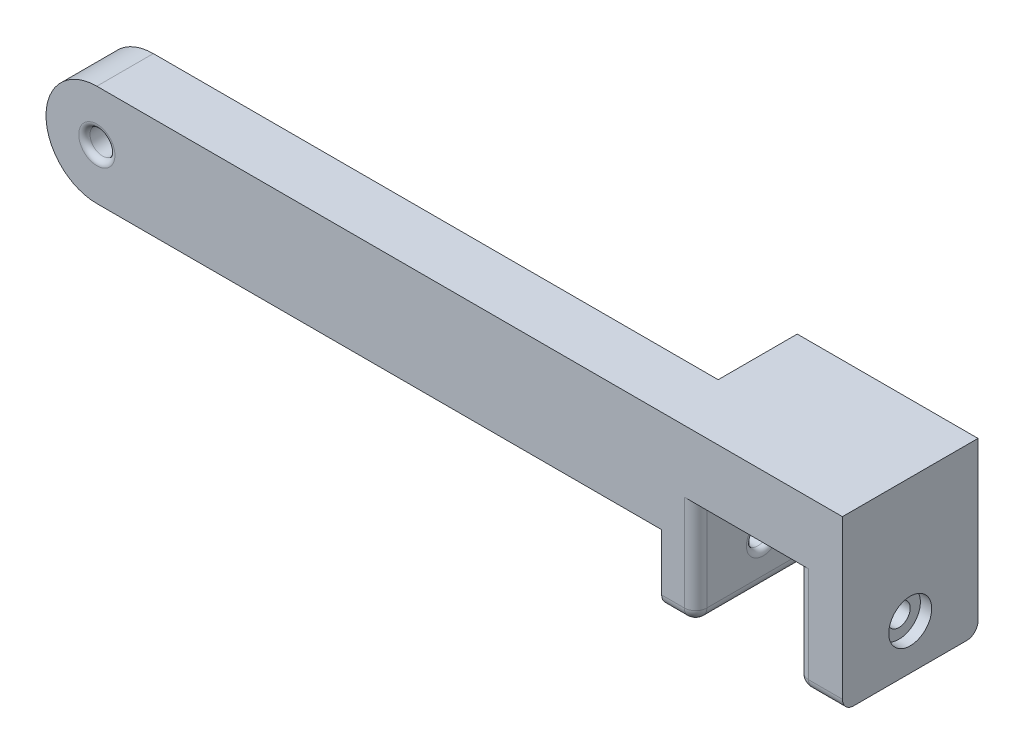
ISO-10303-21;
HEADER;
FILE_DESCRIPTION(('STEP AP214'),'2;1');
FILE_NAME('part.step','',(''),(''),'','','');
FILE_SCHEMA(('AUTOMOTIVE_DESIGN { 1 0 10303 214 1 1 1 1 }'));
ENDSEC;
DATA;
#1=APPLICATION_CONTEXT('core data for automotive mechanical design processes');
#2=APPLICATION_PROTOCOL_DEFINITION('international standard','automotive_design',2000,#1);
#3=PRODUCT_CONTEXT('',#1,'mechanical');
#4=PRODUCT('Part','Part','',(#3));
#5=PRODUCT_RELATED_PRODUCT_CATEGORY('part','',(#4));
#6=PRODUCT_DEFINITION_FORMATION('','',#4);
#7=PRODUCT_DEFINITION_CONTEXT('part definition',#1,'design');
#8=PRODUCT_DEFINITION('design','',#6,#7);
#9=PRODUCT_DEFINITION_SHAPE('','',#8);
#10=(LENGTH_UNIT() NAMED_UNIT(*) SI_UNIT(.MILLI.,.METRE.));
#11=(NAMED_UNIT(*) PLANE_ANGLE_UNIT() SI_UNIT($,.RADIAN.));
#12=(NAMED_UNIT(*) SI_UNIT($,.STERADIAN.) SOLID_ANGLE_UNIT());
#13=UNCERTAINTY_MEASURE_WITH_UNIT(LENGTH_MEASURE(1.E-05),#10,'distance_accuracy_value','');
#14=(GEOMETRIC_REPRESENTATION_CONTEXT(3) GLOBAL_UNCERTAINTY_ASSIGNED_CONTEXT((#13)) GLOBAL_UNIT_ASSIGNED_CONTEXT((#10,
#11,#12)) REPRESENTATION_CONTEXT('',''));
#15=CARTESIAN_POINT('',(0.,0.,0.));
#16=DIRECTION('',(0.,0.,1.));
#17=DIRECTION('',(1.,0.,0.));
#18=AXIS2_PLACEMENT_3D('',#15,#16,#17);
#19=CARTESIAN_POINT('',(50.,-6.5,-0.999999999999997));
#20=DIRECTION('',(1.,0.,0.));
#21=DIRECTION('',(0.,0.,-1.));
#22=AXIS2_PLACEMENT_3D('',#19,#20,#21);
#23=CYLINDRICAL_SURFACE('',#22,1.);
#24=CARTESIAN_POINT('',(52.5,-6.5,-0.999999999999997));
#25=DIRECTION('',(-1.,0.,0.));
#26=DIRECTION('',(0.,0.,1.));
#27=AXIS2_PLACEMENT_3D('',#24,#25,#26);
#28=CIRCLE('',#27,1.);
#29=CARTESIAN_POINT('',(52.5,-6.5,0.));
#30=VERTEX_POINT('',#29);
#31=EDGE_CURVE('E238',#30,#30,#28,.F.);
#32=ORIENTED_EDGE('',*,*,#31,.T.);
#33=EDGE_LOOP('',(#32));
#34=FACE_BOUND('',#33,.T.);
#35=CARTESIAN_POINT('',(50.5,-6.5,-0.999999999999997));
#36=DIRECTION('',(-1.,0.,0.));
#37=DIRECTION('',(0.,0.,1.));
#38=AXIS2_PLACEMENT_3D('',#35,#36,#37);
#39=CIRCLE('',#38,1.);
#40=CARTESIAN_POINT('',(50.5,-6.5,0.));
#41=VERTEX_POINT('',#40);
#42=EDGE_CURVE('E346',#41,#41,#39,.F.);
#43=ORIENTED_EDGE('',*,*,#42,.F.);
#44=EDGE_LOOP('',(#43));
#45=FACE_BOUND('',#44,.T.);
#46=ADVANCED_FACE('F37',(#34,#45),#23,.F.);
#47=CARTESIAN_POINT('',(62.,-6.5,-0.999999999999997));
#48=DIRECTION('',(1.,0.,0.));
#49=DIRECTION('',(0.,0.,-1.));
#50=AXIS2_PLACEMENT_3D('',#47,#48,#49);
#51=CIRCLE('',#50,1.);
#52=CARTESIAN_POINT('',(62.,-6.5,-2.));
#53=VERTEX_POINT('',#52);
#54=EDGE_CURVE('E245',#53,#53,#51,.T.);
#55=ORIENTED_EDGE('',*,*,#54,.F.);
#56=EDGE_LOOP('',(#55));
#57=FACE_BOUND('',#56,.T.);
#58=CARTESIAN_POINT('',(65.,-6.5,-0.999999999999997));
#59=DIRECTION('',(1.,0.,0.));
#60=DIRECTION('',(0.,0.,-1.));
#61=AXIS2_PLACEMENT_3D('',#58,#59,#60);
#62=CIRCLE('',#61,1.);
#63=CARTESIAN_POINT('',(65.,-6.5,-2.));
#64=VERTEX_POINT('',#63);
#65=EDGE_CURVE('E242',#64,#64,#62,.F.);
#66=ORIENTED_EDGE('',*,*,#65,.F.);
#67=EDGE_LOOP('',(#66));
#68=FACE_BOUND('',#67,.T.);
#69=ADVANCED_FACE('F449',(#57,#68),#23,.F.);
#70=CARTESIAN_POINT('',(0.,-10.5,0.));
#71=DIRECTION('',(0.,1.,0.));
#72=DIRECTION('',(0.,0.,1.));
#73=AXIS2_PLACEMENT_3D('',#70,#71,#72);
#74=PLANE('',#73);
#75=DIRECTION('',(0.,0.,-1.));
#76=VECTOR('',#75,1.);
#77=CARTESIAN_POINT('',(66.,-10.5,-7.));
#78=LINE('',#77,#76);
#79=CARTESIAN_POINT('',(66.,-10.5,4.));
#80=VERTEX_POINT('',#79);
#81=CARTESIAN_POINT('',(66.,-10.5,-6.));
#82=VERTEX_POINT('',#81);
#83=EDGE_CURVE('E208',#80,#82,#78,.T.);
#84=ORIENTED_EDGE('',*,*,#83,.F.);
#85=DIRECTION('',(1.,0.,0.));
#86=VECTOR('',#85,1.);
#87=CARTESIAN_POINT('',(62.,-10.5,4.));
#88=LINE('',#87,#86);
#89=CARTESIAN_POINT('',(63.,-10.5,4.));
#90=VERTEX_POINT('',#89);
#91=EDGE_CURVE('E267',#80,#90,#88,.F.);
#92=ORIENTED_EDGE('',*,*,#91,.T.);
#93=DIRECTION('',(0.,0.,-1.));
#94=VECTOR('',#93,1.);
#95=CARTESIAN_POINT('',(63.,-10.5,0.));
#96=LINE('',#95,#94);
#97=CARTESIAN_POINT('',(63.,-10.5,-6.));
#98=VERTEX_POINT('',#97);
#99=EDGE_CURVE('E263',#90,#98,#96,.T.);
#100=ORIENTED_EDGE('',*,*,#99,.T.);
#101=DIRECTION('',(-1.,0.,0.));
#102=VECTOR('',#101,1.);
#103=CARTESIAN_POINT('',(66.,-10.5,-6.));
#104=LINE('',#103,#102);
#105=EDGE_CURVE('E265',#98,#82,#104,.F.);
#106=ORIENTED_EDGE('',*,*,#105,.T.);
#107=EDGE_LOOP('',(#84,#92,#100,#106));
#108=FACE_BOUND('',#107,.T.);
#109=ADVANCED_FACE('F455',(#108),#74,.F.);
#110=CARTESIAN_POINT('',(0.,-4.5,5.));
#111=DIRECTION('',(0.,1.,0.));
#112=DIRECTION('',(0.,0.,1.));
#113=AXIS2_PLACEMENT_3D('',#110,#111,#112);
#114=PLANE('',#113);
#115=DIRECTION('',(1.,0.,0.));
#116=VECTOR('',#115,1.);
#117=CARTESIAN_POINT('',(0.,-4.5,0.));
#118=LINE('',#117,#116);
#119=CARTESIAN_POINT('',(0.,-4.5,0.));
#120=VERTEX_POINT('',#119);
#121=CARTESIAN_POINT('',(50.,-4.5,0.));
#122=VERTEX_POINT('',#121);
#123=EDGE_CURVE('E215',#120,#122,#118,.T.);
#124=ORIENTED_EDGE('',*,*,#123,.T.);
#125=DIRECTION('',(0.,0.,-1.));
#126=VECTOR('',#125,1.);
#127=CARTESIAN_POINT('',(50.,-4.5,5.));
#128=LINE('',#127,#126);
#129=CARTESIAN_POINT('',(50.,-4.5,5.));
#130=VERTEX_POINT('',#129);
#131=EDGE_CURVE('E235',#130,#122,#128,.T.);
#132=ORIENTED_EDGE('',*,*,#131,.F.);
#133=DIRECTION('',(1.,0.,0.));
#134=VECTOR('',#133,1.);
#135=CARTESIAN_POINT('',(0.,-4.5,5.));
#136=LINE('',#135,#134);
#137=CARTESIAN_POINT('',(0.,-4.5,5.));
#138=VERTEX_POINT('',#137);
#139=EDGE_CURVE('E212',#138,#130,#136,.T.);
#140=ORIENTED_EDGE('',*,*,#139,.F.);
#141=DIRECTION('',(0.,0.,-1.));
#142=VECTOR('',#141,1.);
#143=CARTESIAN_POINT('',(0.,-4.5,5.));
#144=LINE('',#143,#142);
#145=EDGE_CURVE('E214',#138,#120,#144,.T.);
#146=ORIENTED_EDGE('',*,*,#145,.T.);
#147=EDGE_LOOP('',(#124,#132,#140,#146));
#148=FACE_BOUND('',#147,.T.);
#149=ADVANCED_FACE('F391',(#148),#114,.F.);
#150=CARTESIAN_POINT('',(0.,4.5,5.));
#151=DIRECTION('',(0.,1.,0.));
#152=DIRECTION('',(0.,0.,1.));
#153=AXIS2_PLACEMENT_3D('',#150,#151,#152);
#154=PLANE('',#153);
#155=DIRECTION('',(1.,0.,0.));
#156=VECTOR('',#155,1.);
#157=CARTESIAN_POINT('',(0.,4.5,0.));
#158=LINE('',#157,#156);
#159=CARTESIAN_POINT('',(0.,4.5,0.));
#160=VERTEX_POINT('',#159);
#161=CARTESIAN_POINT('',(50.,4.5,0.));
#162=VERTEX_POINT('',#161);
#163=EDGE_CURVE('E226',#160,#162,#158,.T.);
#164=ORIENTED_EDGE('',*,*,#163,.F.);
#165=DIRECTION('',(0.,0.,-1.));
#166=VECTOR('',#165,1.);
#167=CARTESIAN_POINT('',(0.,4.5,5.));
#168=LINE('',#167,#166);
#169=CARTESIAN_POINT('',(0.,4.5,5.));
#170=VERTEX_POINT('',#169);
#171=EDGE_CURVE('E398',#170,#160,#168,.T.);
#172=ORIENTED_EDGE('',*,*,#171,.F.);
#173=DIRECTION('',(1.,0.,0.));
#174=VECTOR('',#173,1.);
#175=CARTESIAN_POINT('',(0.,4.5,5.));
#176=LINE('',#175,#174);
#177=CARTESIAN_POINT('',(66.,4.5,5.));
#178=VERTEX_POINT('',#177);
#179=EDGE_CURVE('E194',#170,#178,#176,.T.);
#180=ORIENTED_EDGE('',*,*,#179,.T.);
#181=DIRECTION('',(0.,0.,-1.));
#182=VECTOR('',#181,1.);
#183=CARTESIAN_POINT('',(66.,4.5,-7.));
#184=LINE('',#183,#182);
#185=CARTESIAN_POINT('',(66.,4.5,-7.));
#186=VERTEX_POINT('',#185);
#187=EDGE_CURVE('E172',#178,#186,#184,.T.);
#188=ORIENTED_EDGE('',*,*,#187,.T.);
#189=DIRECTION('',(-1.,0.,0.));
#190=VECTOR('',#189,1.);
#191=CARTESIAN_POINT('',(50.,4.5,-7.));
#192=LINE('',#191,#190);
#193=CARTESIAN_POINT('',(50.,4.5,-7.));
#194=VERTEX_POINT('',#193);
#195=EDGE_CURVE('E182',#186,#194,#192,.T.);
#196=ORIENTED_EDGE('',*,*,#195,.T.);
#197=DIRECTION('',(0.,0.,1.));
#198=VECTOR('',#197,1.);
#199=CARTESIAN_POINT('',(50.,4.5,-7.));
#200=LINE('',#199,#198);
#201=EDGE_CURVE('E188',#194,#162,#200,.T.);
#202=ORIENTED_EDGE('',*,*,#201,.T.);
#203=EDGE_LOOP('',(#164,#172,#180,#188,#196,#202));
#204=FACE_BOUND('',#203,.T.);
#205=ADVANCED_FACE('F192',(#204),#154,.T.);
#206=CARTESIAN_POINT('',(0.,0.,5.));
#207=DIRECTION('',(0.,0.,-1.));
#208=DIRECTION('',(-1.,0.,0.));
#209=AXIS2_PLACEMENT_3D('',#206,#207,#208);
#210=CYLINDRICAL_SURFACE('',#209,4.5);
#211=CARTESIAN_POINT('',(0.,0.,0.));
#212=DIRECTION('',(0.,0.,1.));
#213=DIRECTION('',(1.,0.,0.));
#214=AXIS2_PLACEMENT_3D('',#211,#212,#213);
#215=CIRCLE('',#214,4.5);
#216=EDGE_CURVE('E221',#160,#120,#215,.T.);
#217=ORIENTED_EDGE('',*,*,#216,.T.);
#218=ORIENTED_EDGE('',*,*,#145,.F.);
#219=CARTESIAN_POINT('',(0.,0.,5.));
#220=DIRECTION('',(0.,0.,1.));
#221=DIRECTION('',(1.,0.,0.));
#222=AXIS2_PLACEMENT_3D('',#219,#220,#221);
#223=CIRCLE('',#222,4.5);
#224=EDGE_CURVE('E211',#170,#138,#223,.T.);
#225=ORIENTED_EDGE('',*,*,#224,.F.);
#226=ORIENTED_EDGE('',*,*,#171,.T.);
#227=EDGE_LOOP('',(#217,#218,#225,#226));
#228=FACE_BOUND('',#227,.T.);
#229=ADVANCED_FACE('F371',(#228),#210,.T.);
#230=CARTESIAN_POINT('',(0.,0.,5.));
#231=DIRECTION('',(0.,0.,-1.));
#232=DIRECTION('',(-1.,0.,0.));
#233=AXIS2_PLACEMENT_3D('',#230,#231,#232);
#234=CYLINDRICAL_SURFACE('',#233,1.1);
#235=CARTESIAN_POINT('',(0.,0.,4.5));
#236=DIRECTION('',(0.,0.,1.));
#237=DIRECTION('',(1.,0.,0.));
#238=AXIS2_PLACEMENT_3D('',#235,#236,#237);
#239=CIRCLE('',#238,1.1);
#240=CARTESIAN_POINT('',(1.1,0.,4.5));
#241=VERTEX_POINT('',#240);
#242=EDGE_CURVE('E354',#241,#241,#239,.T.);
#243=ORIENTED_EDGE('',*,*,#242,.T.);
#244=EDGE_LOOP('',(#243));
#245=FACE_BOUND('',#244,.T.);
#246=CARTESIAN_POINT('',(0.,0.,0.5));
#247=DIRECTION('',(0.,0.,1.));
#248=DIRECTION('',(1.,0.,0.));
#249=AXIS2_PLACEMENT_3D('',#246,#247,#248);
#250=CIRCLE('',#249,1.1);
#251=CARTESIAN_POINT('',(1.1,0.,0.5));
#252=VERTEX_POINT('',#251);
#253=EDGE_CURVE('E308',#252,#252,#250,.F.);
#254=ORIENTED_EDGE('',*,*,#253,.T.);
#255=EDGE_LOOP('',(#254));
#256=FACE_BOUND('',#255,.T.);
#257=ADVANCED_FACE('F368',(#245,#256),#234,.F.);
#258=CARTESIAN_POINT('',(0.,0.,5.));
#259=DIRECTION('',(0.,0.,1.));
#260=DIRECTION('',(1.,0.,0.));
#261=AXIS2_PLACEMENT_3D('',#258,#259,#260);
#262=PLANE('',#261);
#263=CARTESIAN_POINT('',(0.,0.,5.));
#264=DIRECTION('',(0.,0.,1.));
#265=DIRECTION('',(1.,0.,0.));
#266=AXIS2_PLACEMENT_3D('',#263,#264,#265);
#267=CIRCLE('',#266,1.6);
#268=CARTESIAN_POINT('',(1.6,0.,5.));
#269=VERTEX_POINT('',#268);
#270=EDGE_CURVE('E45',#269,#269,#267,.F.);
#271=ORIENTED_EDGE('',*,*,#270,.T.);
#272=EDGE_LOOP('',(#271));
#273=FACE_BOUND('',#272,.T.);
#274=DIRECTION('',(0.,1.,0.));
#275=VECTOR('',#274,1.);
#276=CARTESIAN_POINT('',(63.,-10.5,5.));
#277=LINE('',#276,#275);
#278=CARTESIAN_POINT('',(63.,-1.,5.));
#279=VERTEX_POINT('',#278);
#280=CARTESIAN_POINT('',(63.,-9.5,5.));
#281=VERTEX_POINT('',#280);
#282=EDGE_CURVE('E255',#279,#281,#277,.F.);
#283=ORIENTED_EDGE('',*,*,#282,.T.);
#284=DIRECTION('',(1.,0.,0.));
#285=VECTOR('',#284,1.);
#286=CARTESIAN_POINT('',(66.,-9.5,5.));
#287=LINE('',#286,#285);
#288=CARTESIAN_POINT('',(66.,-9.5,5.));
#289=VERTEX_POINT('',#288);
#290=EDGE_CURVE('E257',#281,#289,#287,.T.);
#291=ORIENTED_EDGE('',*,*,#290,.T.);
#292=DIRECTION('',(0.,1.,0.));
#293=VECTOR('',#292,1.);
#294=CARTESIAN_POINT('',(66.,-10.5,5.));
#295=LINE('',#294,#293);
#296=EDGE_CURVE('E204',#289,#178,#295,.T.);
#297=ORIENTED_EDGE('',*,*,#296,.T.);
#298=ORIENTED_EDGE('',*,*,#179,.F.);
#299=ORIENTED_EDGE('',*,*,#224,.T.);
#300=ORIENTED_EDGE('',*,*,#139,.T.);
#301=DIRECTION('',(0.,1.,0.));
#302=VECTOR('',#301,1.);
#303=CARTESIAN_POINT('',(50.,-10.5,5.));
#304=LINE('',#303,#302);
#305=CARTESIAN_POINT('',(50.,-9.5,5.));
#306=VERTEX_POINT('',#305);
#307=EDGE_CURVE('E247',#306,#130,#304,.T.);
#308=ORIENTED_EDGE('',*,*,#307,.F.);
#309=DIRECTION('',(1.,0.,0.));
#310=VECTOR('',#309,1.);
#311=CARTESIAN_POINT('',(53.,-9.5,5.));
#312=LINE('',#311,#310);
#313=CARTESIAN_POINT('',(52.,-9.5,5.));
#314=VERTEX_POINT('',#313);
#315=EDGE_CURVE('E252',#306,#314,#312,.T.);
#316=ORIENTED_EDGE('',*,*,#315,.T.);
#317=DIRECTION('',(0.,1.,0.));
#318=VECTOR('',#317,1.);
#319=CARTESIAN_POINT('',(52.,-1.,5.));
#320=LINE('',#319,#318);
#321=CARTESIAN_POINT('',(52.,-1.,5.));
#322=VERTEX_POINT('',#321);
#323=EDGE_CURVE('E241',#314,#322,#320,.T.);
#324=ORIENTED_EDGE('',*,*,#323,.T.);
#325=DIRECTION('',(1.,0.,0.));
#326=VECTOR('',#325,1.);
#327=CARTESIAN_POINT('',(53.,-1.,5.));
#328=LINE('',#327,#326);
#329=EDGE_CURVE('E195',#322,#279,#328,.T.);
#330=ORIENTED_EDGE('',*,*,#329,.T.);
#331=EDGE_LOOP('',(#283,#291,#297,#298,#299,#300,#308,#316,#324,#330));
#332=FACE_BOUND('',#331,.T.);
#333=ADVANCED_FACE('F359',(#273,#332),#262,.T.);
#334=CARTESIAN_POINT('',(0.,0.,0.));
#335=DIRECTION('',(0.,0.,1.));
#336=DIRECTION('',(1.,0.,0.));
#337=AXIS2_PLACEMENT_3D('',#334,#335,#336);
#338=PLANE('',#337);
#339=CARTESIAN_POINT('',(0.,0.,0.));
#340=DIRECTION('',(0.,0.,1.));
#341=DIRECTION('',(1.,0.,0.));
#342=AXIS2_PLACEMENT_3D('',#339,#340,#341);
#343=CIRCLE('',#342,1.6);
#344=CARTESIAN_POINT('',(1.6,0.,0.));
#345=VERTEX_POINT('',#344);
#346=EDGE_CURVE('E11',#345,#345,#343,.T.);
#347=ORIENTED_EDGE('',*,*,#346,.T.);
#348=EDGE_LOOP('',(#347));
#349=FACE_BOUND('',#348,.T.);
#350=ORIENTED_EDGE('',*,*,#123,.F.);
#351=ORIENTED_EDGE('',*,*,#216,.F.);
#352=ORIENTED_EDGE('',*,*,#163,.T.);
#353=DIRECTION('',(0.,-1.,0.));
#354=VECTOR('',#353,1.);
#355=CARTESIAN_POINT('',(50.,0.,0.));
#356=LINE('',#355,#354);
#357=EDGE_CURVE('E218',#162,#122,#356,.T.);
#358=ORIENTED_EDGE('',*,*,#357,.T.);
#359=EDGE_LOOP('',(#350,#351,#352,#358));
#360=FACE_BOUND('',#359,.T.);
#361=ADVANCED_FACE('F379',(#349,#360),#338,.F.);
#362=CARTESIAN_POINT('',(50.,-10.5,-7.));
#363=DIRECTION('',(-1.,0.,0.));
#364=DIRECTION('',(0.,0.,1.));
#365=AXIS2_PLACEMENT_3D('',#362,#363,#364);
#366=PLANE('',#365);
#367=CARTESIAN_POINT('',(50.,-6.5,-0.999999999999997));
#368=DIRECTION('',(-1.,0.,0.));
#369=DIRECTION('',(0.,0.,1.));
#370=AXIS2_PLACEMENT_3D('',#367,#368,#369);
#371=CIRCLE('',#370,2.);
#372=CARTESIAN_POINT('',(50.,-6.5,1.));
#373=VERTEX_POINT('',#372);
#374=EDGE_CURVE('E332',#373,#373,#371,.F.);
#375=ORIENTED_EDGE('',*,*,#374,.T.);
#376=EDGE_LOOP('',(#375));
#377=FACE_BOUND('',#376,.T.);
#378=DIRECTION('',(0.,0.,1.));
#379=VECTOR('',#378,1.);
#380=CARTESIAN_POINT('',(50.,-10.5,-7.));
#381=LINE('',#380,#379);
#382=CARTESIAN_POINT('',(50.,-10.5,-6.));
#383=VERTEX_POINT('',#382);
#384=CARTESIAN_POINT('',(50.,-10.5,4.));
#385=VERTEX_POINT('',#384);
#386=EDGE_CURVE('E179',#383,#385,#381,.T.);
#387=ORIENTED_EDGE('',*,*,#386,.T.);
#388=CARTESIAN_POINT('',(50.,-9.5,4.));
#389=DIRECTION('',(-1.,0.,0.));
#390=DIRECTION('',(0.,0.,1.));
#391=AXIS2_PLACEMENT_3D('',#388,#389,#390);
#392=CIRCLE('',#391,1.);
#393=EDGE_CURVE('E292',#385,#306,#392,.T.);
#394=ORIENTED_EDGE('',*,*,#393,.T.);
#395=ORIENTED_EDGE('',*,*,#307,.T.);
#396=ORIENTED_EDGE('',*,*,#131,.T.);
#397=ORIENTED_EDGE('',*,*,#357,.F.);
#398=ORIENTED_EDGE('',*,*,#201,.F.);
#399=DIRECTION('',(0.,1.,0.));
#400=VECTOR('',#399,1.);
#401=CARTESIAN_POINT('',(50.,-10.5,-7.));
#402=LINE('',#401,#400);
#403=CARTESIAN_POINT('',(50.,-9.5,-7.));
#404=VERTEX_POINT('',#403);
#405=EDGE_CURVE('E178',#404,#194,#402,.T.);
#406=ORIENTED_EDGE('',*,*,#405,.F.);
#407=CARTESIAN_POINT('',(50.,-9.5,-6.));
#408=DIRECTION('',(-1.,0.,0.));
#409=DIRECTION('',(0.,0.,1.));
#410=AXIS2_PLACEMENT_3D('',#407,#408,#409);
#411=CIRCLE('',#410,1.);
#412=EDGE_CURVE('E290',#404,#383,#411,.T.);
#413=ORIENTED_EDGE('',*,*,#412,.T.);
#414=EDGE_LOOP('',(#387,#394,#395,#396,#397,#398,#406,#413));
#415=FACE_BOUND('',#414,.T.);
#416=ADVANCED_FACE('F382',(#377,#415),#366,.T.);
#417=CARTESIAN_POINT('',(66.,-10.5,-7.));
#418=DIRECTION('',(1.,0.,0.));
#419=DIRECTION('',(0.,0.,-1.));
#420=AXIS2_PLACEMENT_3D('',#417,#418,#419);
#421=PLANE('',#420);
#422=CARTESIAN_POINT('',(66.,-6.5,-0.999999999999997));
#423=DIRECTION('',(1.,0.,0.));
#424=DIRECTION('',(0.,0.,-1.));
#425=AXIS2_PLACEMENT_3D('',#422,#423,#424);
#426=CIRCLE('',#425,1.9);
#427=CARTESIAN_POINT('',(66.,-6.5,-2.9));
#428=VERTEX_POINT('',#427);
#429=EDGE_CURVE('E328',#428,#428,#426,.T.);
#430=ORIENTED_EDGE('',*,*,#429,.F.);
#431=EDGE_LOOP('',(#430));
#432=FACE_BOUND('',#431,.T.);
#433=ORIENTED_EDGE('',*,*,#296,.F.);
#434=CARTESIAN_POINT('',(66.,-9.5,4.));
#435=DIRECTION('',(1.,0.,0.));
#436=DIRECTION('',(0.,0.,-1.));
#437=AXIS2_PLACEMENT_3D('',#434,#435,#436);
#438=CIRCLE('',#437,1.);
#439=EDGE_CURVE('E261',#289,#80,#438,.T.);
#440=ORIENTED_EDGE('',*,*,#439,.T.);
#441=ORIENTED_EDGE('',*,*,#83,.T.);
#442=CARTESIAN_POINT('',(66.,-9.5,-6.));
#443=DIRECTION('',(1.,0.,0.));
#444=DIRECTION('',(0.,0.,-1.));
#445=AXIS2_PLACEMENT_3D('',#442,#443,#444);
#446=CIRCLE('',#445,1.);
#447=CARTESIAN_POINT('',(66.,-9.5,-7.));
#448=VERTEX_POINT('',#447);
#449=EDGE_CURVE('E175',#82,#448,#446,.T.);
#450=ORIENTED_EDGE('',*,*,#449,.T.);
#451=DIRECTION('',(0.,1.,0.));
#452=VECTOR('',#451,1.);
#453=CARTESIAN_POINT('',(66.,-10.5,-7.));
#454=LINE('',#453,#452);
#455=EDGE_CURVE('E167',#448,#186,#454,.T.);
#456=ORIENTED_EDGE('',*,*,#455,.T.);
#457=ORIENTED_EDGE('',*,*,#187,.F.);
#458=EDGE_LOOP('',(#433,#440,#441,#450,#456,#457));
#459=FACE_BOUND('',#458,.T.);
#460=ADVANCED_FACE('F170',(#432,#459),#421,.T.);
#461=CARTESIAN_POINT('',(50.,-10.5,-7.));
#462=DIRECTION('',(0.,0.,-1.));
#463=DIRECTION('',(-1.,0.,0.));
#464=AXIS2_PLACEMENT_3D('',#461,#462,#463);
#465=PLANE('',#464);
#466=ORIENTED_EDGE('',*,*,#455,.F.);
#467=DIRECTION('',(-1.,0.,0.));
#468=VECTOR('',#467,1.);
#469=CARTESIAN_POINT('',(62.,-9.5,-7.));
#470=LINE('',#469,#468);
#471=CARTESIAN_POINT('',(63.,-9.5,-7.));
#472=VERTEX_POINT('',#471);
#473=EDGE_CURVE('E282',#448,#472,#470,.T.);
#474=ORIENTED_EDGE('',*,*,#473,.T.);
#475=DIRECTION('',(0.,-1.,0.));
#476=VECTOR('',#475,1.);
#477=CARTESIAN_POINT('',(63.,-1.,-7.));
#478=LINE('',#477,#476);
#479=CARTESIAN_POINT('',(63.,-1.,-7.));
#480=VERTEX_POINT('',#479);
#481=EDGE_CURVE('E279',#472,#480,#478,.F.);
#482=ORIENTED_EDGE('',*,*,#481,.T.);
#483=DIRECTION('',(1.,0.,0.));
#484=VECTOR('',#483,1.);
#485=CARTESIAN_POINT('',(50.,-1.,-7.));
#486=LINE('',#485,#484);
#487=CARTESIAN_POINT('',(52.,-1.,-7.));
#488=VERTEX_POINT('',#487);
#489=EDGE_CURVE('E232',#488,#480,#486,.T.);
#490=ORIENTED_EDGE('',*,*,#489,.F.);
#491=DIRECTION('',(0.,1.,0.));
#492=VECTOR('',#491,1.);
#493=CARTESIAN_POINT('',(52.,-10.5,-7.));
#494=LINE('',#493,#492);
#495=CARTESIAN_POINT('',(52.,-9.5,-7.));
#496=VERTEX_POINT('',#495);
#497=EDGE_CURVE('E277',#488,#496,#494,.F.);
#498=ORIENTED_EDGE('',*,*,#497,.T.);
#499=DIRECTION('',(-1.,0.,0.));
#500=VECTOR('',#499,1.);
#501=CARTESIAN_POINT('',(50.,-9.5,-7.));
#502=LINE('',#501,#500);
#503=EDGE_CURVE('E275',#496,#404,#502,.T.);
#504=ORIENTED_EDGE('',*,*,#503,.T.);
#505=ORIENTED_EDGE('',*,*,#405,.T.);
#506=ORIENTED_EDGE('',*,*,#195,.F.);
#507=EDGE_LOOP('',(#466,#474,#482,#490,#498,#504,#505,#506));
#508=FACE_BOUND('',#507,.T.);
#509=ADVANCED_FACE('F183',(#508),#465,.T.);
#510=DIRECTION('',(0.,0.,1.));
#511=VECTOR('',#510,1.);
#512=CARTESIAN_POINT('',(52.,-10.5,0.));
#513=LINE('',#512,#511);
#514=CARTESIAN_POINT('',(52.,-10.5,-6.));
#515=VERTEX_POINT('',#514);
#516=CARTESIAN_POINT('',(52.,-10.5,4.));
#517=VERTEX_POINT('',#516);
#518=EDGE_CURVE('E284',#515,#517,#513,.T.);
#519=ORIENTED_EDGE('',*,*,#518,.T.);
#520=DIRECTION('',(1.,0.,0.));
#521=VECTOR('',#520,1.);
#522=CARTESIAN_POINT('',(50.,-10.5,4.));
#523=LINE('',#522,#521);
#524=EDGE_CURVE('E288',#517,#385,#523,.F.);
#525=ORIENTED_EDGE('',*,*,#524,.T.);
#526=ORIENTED_EDGE('',*,*,#386,.F.);
#527=DIRECTION('',(-1.,0.,0.));
#528=VECTOR('',#527,1.);
#529=CARTESIAN_POINT('',(53.,-10.5,-6.));
#530=LINE('',#529,#528);
#531=EDGE_CURVE('E286',#383,#515,#530,.F.);
#532=ORIENTED_EDGE('',*,*,#531,.T.);
#533=EDGE_LOOP('',(#519,#525,#526,#532));
#534=FACE_BOUND('',#533,.T.);
#535=ADVANCED_FACE('F415',(#534),#74,.F.);
#536=CARTESIAN_POINT('',(62.,-10.5,-8.99999999999999));
#537=DIRECTION('',(1.,0.,0.));
#538=DIRECTION('',(0.,0.,-1.));
#539=AXIS2_PLACEMENT_3D('',#536,#537,#538);
#540=PLANE('',#539);
#541=ORIENTED_EDGE('',*,*,#54,.T.);
#542=EDGE_LOOP('',(#541));
#543=FACE_BOUND('',#542,.T.);
#544=DIRECTION('',(0.,0.,-1.));
#545=VECTOR('',#544,1.);
#546=CARTESIAN_POINT('',(62.,-9.5,-8.99999999999999));
#547=LINE('',#546,#545);
#548=CARTESIAN_POINT('',(62.,-9.5,-6.));
#549=VERTEX_POINT('',#548);
#550=CARTESIAN_POINT('',(62.,-9.5,4.));
#551=VERTEX_POINT('',#550);
#552=EDGE_CURVE('E271',#549,#551,#547,.F.);
#553=ORIENTED_EDGE('',*,*,#552,.T.);
#554=DIRECTION('',(0.,1.,0.));
#555=VECTOR('',#554,1.);
#556=CARTESIAN_POINT('',(62.,-1.,4.));
#557=LINE('',#556,#555);
#558=CARTESIAN_POINT('',(62.,-1.,4.));
#559=VERTEX_POINT('',#558);
#560=EDGE_CURVE('E273',#551,#559,#557,.T.);
#561=ORIENTED_EDGE('',*,*,#560,.T.);
#562=DIRECTION('',(0.,0.,-1.));
#563=VECTOR('',#562,1.);
#564=CARTESIAN_POINT('',(62.,-1.,-8.99999999999999));
#565=LINE('',#564,#563);
#566=CARTESIAN_POINT('',(62.,-1.,-6.));
#567=VERTEX_POINT('',#566);
#568=EDGE_CURVE('E423',#559,#567,#565,.T.);
#569=ORIENTED_EDGE('',*,*,#568,.T.);
#570=DIRECTION('',(0.,-1.,0.));
#571=VECTOR('',#570,1.);
#572=CARTESIAN_POINT('',(62.,-10.5,-6.));
#573=LINE('',#572,#571);
#574=EDGE_CURVE('E269',#567,#549,#573,.T.);
#575=ORIENTED_EDGE('',*,*,#574,.T.);
#576=EDGE_LOOP('',(#553,#561,#569,#575));
#577=FACE_BOUND('',#576,.T.);
#578=ADVANCED_FACE('F469',(#543,#577),#540,.F.);
#579=CARTESIAN_POINT('',(53.,-10.5,-8.99999999999999));
#580=DIRECTION('',(-1.,0.,0.));
#581=DIRECTION('',(0.,0.,1.));
#582=AXIS2_PLACEMENT_3D('',#579,#580,#581);
#583=PLANE('',#582);
#584=DIRECTION('',(0.,0.,1.));
#585=VECTOR('',#584,1.);
#586=CARTESIAN_POINT('',(53.,-1.,-8.99999999999999));
#587=LINE('',#586,#585);
#588=CARTESIAN_POINT('',(53.,-1.,-6.));
#589=VERTEX_POINT('',#588);
#590=CARTESIAN_POINT('',(53.,-1.,4.));
#591=VERTEX_POINT('',#590);
#592=EDGE_CURVE('E197',#589,#591,#587,.T.);
#593=ORIENTED_EDGE('',*,*,#592,.T.);
#594=DIRECTION('',(0.,1.,0.));
#595=VECTOR('',#594,1.);
#596=CARTESIAN_POINT('',(53.,-10.5,4.));
#597=LINE('',#596,#595);
#598=CARTESIAN_POINT('',(53.,-9.5,4.));
#599=VERTEX_POINT('',#598);
#600=EDGE_CURVE('E57',#591,#599,#597,.F.);
#601=ORIENTED_EDGE('',*,*,#600,.T.);
#602=DIRECTION('',(0.,0.,1.));
#603=VECTOR('',#602,1.);
#604=CARTESIAN_POINT('',(53.,-9.5,-8.99999999999999));
#605=LINE('',#604,#603);
#606=CARTESIAN_POINT('',(53.,-9.5,-6.));
#607=VERTEX_POINT('',#606);
#608=EDGE_CURVE('E52',#599,#607,#605,.F.);
#609=ORIENTED_EDGE('',*,*,#608,.T.);
#610=DIRECTION('',(0.,1.,0.));
#611=VECTOR('',#610,1.);
#612=CARTESIAN_POINT('',(53.,-1.,-6.));
#613=LINE('',#612,#611);
#614=EDGE_CURVE('E295',#607,#589,#613,.T.);
#615=ORIENTED_EDGE('',*,*,#614,.T.);
#616=EDGE_LOOP('',(#593,#601,#609,#615));
#617=FACE_BOUND('',#616,.T.);
#618=CARTESIAN_POINT('',(53.,-6.5,-0.999999999999997));
#619=DIRECTION('',(-1.,0.,0.));
#620=DIRECTION('',(0.,0.,1.));
#621=AXIS2_PLACEMENT_3D('',#618,#619,#620);
#622=CIRCLE('',#621,1.5);
#623=CARTESIAN_POINT('',(53.,-6.5,0.500000000000003));
#624=VERTEX_POINT('',#623);
#625=EDGE_CURVE('E234',#624,#624,#622,.T.);
#626=ORIENTED_EDGE('',*,*,#625,.T.);
#627=EDGE_LOOP('',(#626));
#628=FACE_BOUND('',#627,.T.);
#629=ADVANCED_FACE('F465',(#617,#628),#583,.F.);
#630=CARTESIAN_POINT('',(0.,-1.,0.));
#631=DIRECTION('',(0.,1.,0.));
#632=DIRECTION('',(0.,0.,1.));
#633=AXIS2_PLACEMENT_3D('',#630,#631,#632);
#634=PLANE('',#633);
#635=ORIENTED_EDGE('',*,*,#489,.T.);
#636=CARTESIAN_POINT('',(63.,-1.,-6.));
#637=DIRECTION('',(0.,1.,0.));
#638=DIRECTION('',(0.,0.,1.));
#639=AXIS2_PLACEMENT_3D('',#636,#637,#638);
#640=CIRCLE('',#639,1.);
#641=EDGE_CURVE('E301',#480,#567,#640,.T.);
#642=ORIENTED_EDGE('',*,*,#641,.T.);
#643=ORIENTED_EDGE('',*,*,#568,.F.);
#644=CARTESIAN_POINT('',(63.,-1.,4.));
#645=DIRECTION('',(0.,1.,0.));
#646=DIRECTION('',(0.,0.,1.));
#647=AXIS2_PLACEMENT_3D('',#644,#645,#646);
#648=CIRCLE('',#647,1.);
#649=EDGE_CURVE('E298',#559,#279,#648,.T.);
#650=ORIENTED_EDGE('',*,*,#649,.T.);
#651=ORIENTED_EDGE('',*,*,#329,.F.);
#652=CARTESIAN_POINT('',(52.,-1.,4.));
#653=DIRECTION('',(0.,1.,0.));
#654=DIRECTION('',(0.,0.,1.));
#655=AXIS2_PLACEMENT_3D('',#652,#653,#654);
#656=CIRCLE('',#655,1.);
#657=EDGE_CURVE('E303',#322,#591,#656,.T.);
#658=ORIENTED_EDGE('',*,*,#657,.T.);
#659=ORIENTED_EDGE('',*,*,#592,.F.);
#660=CARTESIAN_POINT('',(52.,-1.,-6.));
#661=DIRECTION('',(0.,1.,0.));
#662=DIRECTION('',(0.,0.,1.));
#663=AXIS2_PLACEMENT_3D('',#660,#661,#662);
#664=CIRCLE('',#663,1.);
#665=EDGE_CURVE('E305',#589,#488,#664,.T.);
#666=ORIENTED_EDGE('',*,*,#665,.T.);
#667=EDGE_LOOP('',(#635,#642,#643,#650,#651,#658,#659,#666));
#668=FACE_BOUND('',#667,.T.);
#669=ADVANCED_FACE('F461',(#668),#634,.F.);
#670=CARTESIAN_POINT('',(52.5,-6.5,-0.999999999999997));
#671=DIRECTION('',(-1.,0.,0.));
#672=DIRECTION('',(0.,0.,1.));
#673=AXIS2_PLACEMENT_3D('',#670,#671,#672);
#674=TOROIDAL_SURFACE('',#673,1.5,0.5);
#675=ORIENTED_EDGE('',*,*,#31,.F.);
#676=EDGE_LOOP('',(#675));
#677=FACE_BOUND('',#676,.T.);
#678=ORIENTED_EDGE('',*,*,#625,.F.);
#679=EDGE_LOOP('',(#678));
#680=FACE_BOUND('',#679,.T.);
#681=ADVANCED_FACE('F464',(#677,#680),#674,.T.);
#682=CARTESIAN_POINT('',(65.,-6.5,-0.999999999999997));
#683=DIRECTION('',(1.,0.,0.));
#684=DIRECTION('',(0.,0.,-1.));
#685=AXIS2_PLACEMENT_3D('',#682,#683,#684);
#686=PLANE('',#685);
#687=CARTESIAN_POINT('',(65.,-6.5,-0.999999999999997));
#688=DIRECTION('',(1.,0.,0.));
#689=DIRECTION('',(0.,0.,-1.));
#690=AXIS2_PLACEMENT_3D('',#687,#688,#689);
#691=CIRCLE('',#690,1.9);
#692=CARTESIAN_POINT('',(65.,-6.5,-2.9));
#693=VERTEX_POINT('',#692);
#694=EDGE_CURVE('E246',#693,#693,#691,.T.);
#695=ORIENTED_EDGE('',*,*,#694,.T.);
#696=EDGE_LOOP('',(#695));
#697=FACE_BOUND('',#696,.T.);
#698=ORIENTED_EDGE('',*,*,#65,.T.);
#699=EDGE_LOOP('',(#698));
#700=FACE_BOUND('',#699,.T.);
#701=ADVANCED_FACE('F493',(#697,#700),#686,.T.);
#702=CARTESIAN_POINT('',(65.,-6.5,-0.999999999999997));
#703=DIRECTION('',(1.,0.,0.));
#704=DIRECTION('',(0.,0.,-1.));
#705=AXIS2_PLACEMENT_3D('',#702,#703,#704);
#706=CYLINDRICAL_SURFACE('',#705,1.9);
#707=ORIENTED_EDGE('',*,*,#694,.F.);
#708=EDGE_LOOP('',(#707));
#709=FACE_BOUND('',#708,.T.);
#710=ORIENTED_EDGE('',*,*,#429,.T.);
#711=EDGE_LOOP('',(#710));
#712=FACE_BOUND('',#711,.T.);
#713=ADVANCED_FACE('F460',(#709,#712),#706,.F.);
#714=CARTESIAN_POINT('',(50.,-9.5,-6.));
#715=DIRECTION('',(1.,0.,0.));
#716=DIRECTION('',(0.,0.,-1.));
#717=AXIS2_PLACEMENT_3D('',#714,#715,#716);
#718=CYLINDRICAL_SURFACE('',#717,1.);
#719=ORIENTED_EDGE('',*,*,#449,.F.);
#720=ORIENTED_EDGE('',*,*,#105,.F.);
#721=CARTESIAN_POINT('',(63.,-9.5,-6.));
#722=DIRECTION('',(-1.,0.,0.));
#723=DIRECTION('',(0.,0.,1.));
#724=AXIS2_PLACEMENT_3D('',#721,#722,#723);
#725=CIRCLE('',#724,1.);
#726=EDGE_CURVE('E325',#472,#98,#725,.T.);
#727=ORIENTED_EDGE('',*,*,#726,.F.);
#728=ORIENTED_EDGE('',*,*,#473,.F.);
#729=EDGE_LOOP('',(#719,#720,#727,#728));
#730=FACE_BOUND('',#729,.T.);
#731=ADVANCED_FACE('F519',(#730),#718,.T.);
#732=CARTESIAN_POINT('',(63.,-10.5,-6.));
#733=DIRECTION('',(0.,1.,0.));
#734=DIRECTION('',(0.,0.,1.));
#735=AXIS2_PLACEMENT_3D('',#732,#733,#734);
#736=CYLINDRICAL_SURFACE('',#735,1.);
#737=ORIENTED_EDGE('',*,*,#641,.F.);
#738=ORIENTED_EDGE('',*,*,#481,.F.);
#739=CARTESIAN_POINT('',(63.,-9.5,-6.));
#740=DIRECTION('',(0.,-1.,0.));
#741=DIRECTION('',(0.,0.,-1.));
#742=AXIS2_PLACEMENT_3D('',#739,#740,#741);
#743=CIRCLE('',#742,1.);
#744=EDGE_CURVE('E322',#549,#472,#743,.T.);
#745=ORIENTED_EDGE('',*,*,#744,.F.);
#746=ORIENTED_EDGE('',*,*,#574,.F.);
#747=EDGE_LOOP('',(#737,#738,#745,#746));
#748=FACE_BOUND('',#747,.T.);
#749=ADVANCED_FACE('F515',(#748),#736,.T.);
#750=CARTESIAN_POINT('',(63.,-9.5,-6.));
#751=DIRECTION('',(0.,0.,1.));
#752=DIRECTION('',(1.,0.,0.));
#753=AXIS2_PLACEMENT_3D('',#750,#751,#752);
#754=SPHERICAL_SURFACE('',#753,1.);
#755=ORIENTED_EDGE('',*,*,#744,.T.);
#756=ORIENTED_EDGE('',*,*,#726,.T.);
#757=CARTESIAN_POINT('',(63.,-9.5,-6.));
#758=DIRECTION('',(0.,0.,-1.));
#759=DIRECTION('',(-1.,0.,0.));
#760=AXIS2_PLACEMENT_3D('',#757,#758,#759);
#761=CIRCLE('',#760,1.);
#762=EDGE_CURVE('E319',#549,#98,#761,.F.);
#763=ORIENTED_EDGE('',*,*,#762,.F.);
#764=EDGE_LOOP('',(#755,#756,#763));
#765=FACE_BOUND('',#764,.T.);
#766=ADVANCED_FACE('F511',(#765),#754,.T.);
#767=CARTESIAN_POINT('',(63.,-9.5,0.));
#768=DIRECTION('',(0.,0.,-1.));
#769=DIRECTION('',(-1.,0.,0.));
#770=AXIS2_PLACEMENT_3D('',#767,#768,#769);
#771=CYLINDRICAL_SURFACE('',#770,1.);
#772=ORIENTED_EDGE('',*,*,#762,.T.);
#773=ORIENTED_EDGE('',*,*,#99,.F.);
#774=CARTESIAN_POINT('',(63.,-9.5,4.));
#775=DIRECTION('',(0.,0.,1.));
#776=DIRECTION('',(1.,0.,0.));
#777=AXIS2_PLACEMENT_3D('',#774,#775,#776);
#778=CIRCLE('',#777,1.);
#779=EDGE_CURVE('E316',#551,#90,#778,.T.);
#780=ORIENTED_EDGE('',*,*,#779,.F.);
#781=ORIENTED_EDGE('',*,*,#552,.F.);
#782=EDGE_LOOP('',(#772,#773,#780,#781));
#783=FACE_BOUND('',#782,.T.);
#784=ADVANCED_FACE('F507',(#783),#771,.T.);
#785=CARTESIAN_POINT('',(63.,-10.5,4.));
#786=DIRECTION('',(0.,-1.,0.));
#787=DIRECTION('',(0.,0.,-1.));
#788=AXIS2_PLACEMENT_3D('',#785,#786,#787);
#789=CYLINDRICAL_SURFACE('',#788,1.);
#790=ORIENTED_EDGE('',*,*,#649,.F.);
#791=ORIENTED_EDGE('',*,*,#560,.F.);
#792=CARTESIAN_POINT('',(63.,-9.5,4.));
#793=DIRECTION('',(0.,-1.,0.));
#794=DIRECTION('',(0.,0.,-1.));
#795=AXIS2_PLACEMENT_3D('',#792,#793,#794);
#796=CIRCLE('',#795,1.);
#797=EDGE_CURVE('E312',#281,#551,#796,.T.);
#798=ORIENTED_EDGE('',*,*,#797,.F.);
#799=ORIENTED_EDGE('',*,*,#282,.F.);
#800=EDGE_LOOP('',(#790,#791,#798,#799));
#801=FACE_BOUND('',#800,.T.);
#802=ADVANCED_FACE('F503',(#801),#789,.T.);
#803=CARTESIAN_POINT('',(63.,-9.5,4.));
#804=DIRECTION('',(0.,0.,1.));
#805=DIRECTION('',(1.,0.,0.));
#806=AXIS2_PLACEMENT_3D('',#803,#804,#805);
#807=SPHERICAL_SURFACE('',#806,1.);
#808=ORIENTED_EDGE('',*,*,#797,.T.);
#809=ORIENTED_EDGE('',*,*,#779,.T.);
#810=CARTESIAN_POINT('',(63.,-9.5,4.));
#811=DIRECTION('',(-1.,0.,0.));
#812=DIRECTION('',(0.,0.,1.));
#813=AXIS2_PLACEMENT_3D('',#810,#811,#812);
#814=CIRCLE('',#813,1.);
#815=EDGE_CURVE('E309',#281,#90,#814,.F.);
#816=ORIENTED_EDGE('',*,*,#815,.F.);
#817=EDGE_LOOP('',(#808,#809,#816));
#818=FACE_BOUND('',#817,.T.);
#819=ADVANCED_FACE('F499',(#818),#807,.T.);
#820=CARTESIAN_POINT('',(0.,-9.5,4.));
#821=DIRECTION('',(-1.,0.,0.));
#822=DIRECTION('',(0.,0.,1.));
#823=AXIS2_PLACEMENT_3D('',#820,#821,#822);
#824=CYLINDRICAL_SURFACE('',#823,1.);
#825=ORIENTED_EDGE('',*,*,#815,.T.);
#826=ORIENTED_EDGE('',*,*,#91,.F.);
#827=ORIENTED_EDGE('',*,*,#439,.F.);
#828=ORIENTED_EDGE('',*,*,#290,.F.);
#829=EDGE_LOOP('',(#825,#826,#827,#828));
#830=FACE_BOUND('',#829,.T.);
#831=ADVANCED_FACE('F495',(#830),#824,.T.);
#832=CARTESIAN_POINT('',(52.,-10.5,-6.));
#833=DIRECTION('',(0.,-1.,0.));
#834=DIRECTION('',(0.,0.,-1.));
#835=AXIS2_PLACEMENT_3D('',#832,#833,#834);
#836=CYLINDRICAL_SURFACE('',#835,1.);
#837=ORIENTED_EDGE('',*,*,#665,.F.);
#838=ORIENTED_EDGE('',*,*,#614,.F.);
#839=CARTESIAN_POINT('',(52.,-9.5,-6.));
#840=DIRECTION('',(0.,-1.,0.));
#841=DIRECTION('',(0.,0.,-1.));
#842=AXIS2_PLACEMENT_3D('',#839,#840,#841);
#843=CIRCLE('',#842,1.);
#844=EDGE_CURVE('E313',#496,#607,#843,.T.);
#845=ORIENTED_EDGE('',*,*,#844,.F.);
#846=ORIENTED_EDGE('',*,*,#497,.F.);
#847=EDGE_LOOP('',(#837,#838,#845,#846));
#848=FACE_BOUND('',#847,.T.);
#849=ADVANCED_FACE('F498',(#848),#836,.T.);
#850=CARTESIAN_POINT('',(50.,-9.5,-6.));
#851=DIRECTION('',(1.,0.,0.));
#852=DIRECTION('',(0.,0.,-1.));
#853=AXIS2_PLACEMENT_3D('',#850,#851,#852);
#854=CYLINDRICAL_SURFACE('',#853,1.);
#855=ORIENTED_EDGE('',*,*,#412,.F.);
#856=ORIENTED_EDGE('',*,*,#503,.F.);
#857=CARTESIAN_POINT('',(52.,-9.5,-6.));
#858=DIRECTION('',(1.,0.,0.));
#859=DIRECTION('',(0.,0.,-1.));
#860=AXIS2_PLACEMENT_3D('',#857,#858,#859);
#861=CIRCLE('',#860,1.);
#862=EDGE_CURVE('E341',#515,#496,#861,.T.);
#863=ORIENTED_EDGE('',*,*,#862,.F.);
#864=ORIENTED_EDGE('',*,*,#531,.F.);
#865=EDGE_LOOP('',(#855,#856,#863,#864));
#866=FACE_BOUND('',#865,.T.);
#867=ADVANCED_FACE('F410',(#866),#854,.T.);
#868=CARTESIAN_POINT('',(52.,-9.5,-6.));
#869=DIRECTION('',(0.,0.,1.));
#870=DIRECTION('',(1.,0.,0.));
#871=AXIS2_PLACEMENT_3D('',#868,#869,#870);
#872=SPHERICAL_SURFACE('',#871,1.);
#873=ORIENTED_EDGE('',*,*,#862,.T.);
#874=ORIENTED_EDGE('',*,*,#844,.T.);
#875=CARTESIAN_POINT('',(52.,-9.5,-6.));
#876=DIRECTION('',(0.,0.,-1.));
#877=DIRECTION('',(-1.,0.,0.));
#878=AXIS2_PLACEMENT_3D('',#875,#876,#877);
#879=CIRCLE('',#878,1.);
#880=EDGE_CURVE('E338',#515,#607,#879,.F.);
#881=ORIENTED_EDGE('',*,*,#880,.F.);
#882=EDGE_LOOP('',(#873,#874,#881));
#883=FACE_BOUND('',#882,.T.);
#884=ADVANCED_FACE('F538',(#883),#872,.T.);
#885=CARTESIAN_POINT('',(52.,0.,4.));
#886=DIRECTION('',(0.,-1.,0.));
#887=DIRECTION('',(0.,0.,-1.));
#888=AXIS2_PLACEMENT_3D('',#885,#886,#887);
#889=CYLINDRICAL_SURFACE('',#888,1.);
#890=ORIENTED_EDGE('',*,*,#657,.F.);
#891=ORIENTED_EDGE('',*,*,#323,.F.);
#892=CARTESIAN_POINT('',(52.,-9.5,4.));
#893=DIRECTION('',(0.,-1.,0.));
#894=DIRECTION('',(0.,0.,-1.));
#895=AXIS2_PLACEMENT_3D('',#892,#893,#894);
#896=CIRCLE('',#895,1.);
#897=EDGE_CURVE('E335',#599,#314,#896,.T.);
#898=ORIENTED_EDGE('',*,*,#897,.F.);
#899=ORIENTED_EDGE('',*,*,#600,.F.);
#900=EDGE_LOOP('',(#890,#891,#898,#899));
#901=FACE_BOUND('',#900,.T.);
#902=ADVANCED_FACE('F534',(#901),#889,.T.);
#903=CARTESIAN_POINT('',(52.,-9.5,0.));
#904=DIRECTION('',(0.,0.,1.));
#905=DIRECTION('',(1.,0.,0.));
#906=AXIS2_PLACEMENT_3D('',#903,#904,#905);
#907=CYLINDRICAL_SURFACE('',#906,1.);
#908=ORIENTED_EDGE('',*,*,#880,.T.);
#909=ORIENTED_EDGE('',*,*,#608,.F.);
#910=CARTESIAN_POINT('',(52.,-9.5,4.));
#911=DIRECTION('',(0.,0.,1.));
#912=DIRECTION('',(1.,0.,0.));
#913=AXIS2_PLACEMENT_3D('',#910,#911,#912);
#914=CIRCLE('',#913,1.);
#915=EDGE_CURVE('E331',#517,#599,#914,.T.);
#916=ORIENTED_EDGE('',*,*,#915,.F.);
#917=ORIENTED_EDGE('',*,*,#518,.F.);
#918=EDGE_LOOP('',(#908,#909,#916,#917));
#919=FACE_BOUND('',#918,.T.);
#920=ADVANCED_FACE('F530',(#919),#907,.T.);
#921=CARTESIAN_POINT('',(52.,-9.5,4.));
#922=DIRECTION('',(0.,0.,1.));
#923=DIRECTION('',(1.,0.,0.));
#924=AXIS2_PLACEMENT_3D('',#921,#922,#923);
#925=SPHERICAL_SURFACE('',#924,1.);
#926=ORIENTED_EDGE('',*,*,#915,.T.);
#927=ORIENTED_EDGE('',*,*,#897,.T.);
#928=CARTESIAN_POINT('',(52.,-9.5,4.));
#929=DIRECTION('',(1.,0.,0.));
#930=DIRECTION('',(0.,0.,-1.));
#931=AXIS2_PLACEMENT_3D('',#928,#929,#930);
#932=CIRCLE('',#931,1.);
#933=EDGE_CURVE('E329',#517,#314,#932,.F.);
#934=ORIENTED_EDGE('',*,*,#933,.F.);
#935=EDGE_LOOP('',(#926,#927,#934));
#936=FACE_BOUND('',#935,.T.);
#937=ADVANCED_FACE('F526',(#936),#925,.T.);
#938=CARTESIAN_POINT('',(0.,-9.5,4.));
#939=DIRECTION('',(-1.,0.,0.));
#940=DIRECTION('',(0.,0.,1.));
#941=AXIS2_PLACEMENT_3D('',#938,#939,#940);
#942=CYLINDRICAL_SURFACE('',#941,1.);
#943=ORIENTED_EDGE('',*,*,#393,.F.);
#944=ORIENTED_EDGE('',*,*,#524,.F.);
#945=ORIENTED_EDGE('',*,*,#933,.T.);
#946=ORIENTED_EDGE('',*,*,#315,.F.);
#947=EDGE_LOOP('',(#943,#944,#945,#946));
#948=FACE_BOUND('',#947,.T.);
#949=ADVANCED_FACE('F444',(#948),#942,.T.);
#950=CARTESIAN_POINT('',(50.5,-6.5,-0.999999999999997));
#951=DIRECTION('',(-1.,0.,0.));
#952=DIRECTION('',(0.,0.,1.));
#953=AXIS2_PLACEMENT_3D('',#950,#951,#952);
#954=PLANE('',#953);
#955=CARTESIAN_POINT('',(50.5,-6.5,-0.999999999999997));
#956=DIRECTION('',(-1.,0.,0.));
#957=DIRECTION('',(0.,0.,1.));
#958=AXIS2_PLACEMENT_3D('',#955,#956,#957);
#959=CIRCLE('',#958,2.);
#960=CARTESIAN_POINT('',(50.5,-6.5,1.));
#961=VERTEX_POINT('',#960);
#962=EDGE_CURVE('E349',#961,#961,#959,.T.);
#963=ORIENTED_EDGE('',*,*,#962,.T.);
#964=EDGE_LOOP('',(#963));
#965=FACE_BOUND('',#964,.T.);
#966=ORIENTED_EDGE('',*,*,#42,.T.);
#967=EDGE_LOOP('',(#966));
#968=FACE_BOUND('',#967,.T.);
#969=ADVANCED_FACE('F435',(#965,#968),#954,.T.);
#970=CARTESIAN_POINT('',(45.,-6.5,-0.999999999999997));
#971=DIRECTION('',(1.,0.,0.));
#972=DIRECTION('',(0.,0.,-1.));
#973=AXIS2_PLACEMENT_3D('',#970,#971,#972);
#974=CYLINDRICAL_SURFACE('',#973,2.);
#975=ORIENTED_EDGE('',*,*,#374,.F.);
#976=EDGE_LOOP('',(#975));
#977=FACE_BOUND('',#976,.T.);
#978=ORIENTED_EDGE('',*,*,#962,.F.);
#979=EDGE_LOOP('',(#978));
#980=FACE_BOUND('',#979,.T.);
#981=ADVANCED_FACE('F365',(#977,#980),#974,.F.);
#982=CARTESIAN_POINT('',(0.,0.,4.5));
#983=DIRECTION('',(0.,0.,1.));
#984=DIRECTION('',(1.,0.,0.));
#985=AXIS2_PLACEMENT_3D('',#982,#983,#984);
#986=TOROIDAL_SURFACE('',#985,1.6,0.5);
#987=ORIENTED_EDGE('',*,*,#270,.F.);
#988=EDGE_LOOP('',(#987));
#989=FACE_BOUND('',#988,.T.);
#990=ORIENTED_EDGE('',*,*,#242,.F.);
#991=EDGE_LOOP('',(#990));
#992=FACE_BOUND('',#991,.T.);
#993=ADVANCED_FACE('F362',(#989,#992),#986,.T.);
#994=CARTESIAN_POINT('',(0.,0.,0.5));
#995=DIRECTION('',(0.,0.,1.));
#996=DIRECTION('',(1.,0.,0.));
#997=AXIS2_PLACEMENT_3D('',#994,#995,#996);
#998=TOROIDAL_SURFACE('',#997,1.6,0.5);
#999=ORIENTED_EDGE('',*,*,#253,.F.);
#1000=EDGE_LOOP('',(#999));
#1001=FACE_BOUND('',#1000,.T.);
#1002=ORIENTED_EDGE('',*,*,#346,.F.);
#1003=EDGE_LOOP('',(#1002));
#1004=FACE_BOUND('',#1003,.T.);
#1005=ADVANCED_FACE('F39',(#1001,#1004),#998,.T.);
#1006=CLOSED_SHELL('',(#46,#69,#109,#149,#205,#229,#257,#333,#361,#416,#460,#509,#535,#578,#629,
#669,#681,#701,#713,#731,#749,#766,#784,#802,#819,#831,#849,#867,#884,#902,#920,#937,#949,#969,
#981,#993,#1005));
#1007=MANIFOLD_SOLID_BREP('B2',#1006);
#1008=ADVANCED_BREP_SHAPE_REPRESENTATION('',(#18,#1007),#14);
#1009=SHAPE_DEFINITION_REPRESENTATION(#9,#1008);
ENDSEC;
END-ISO-10303-21;
